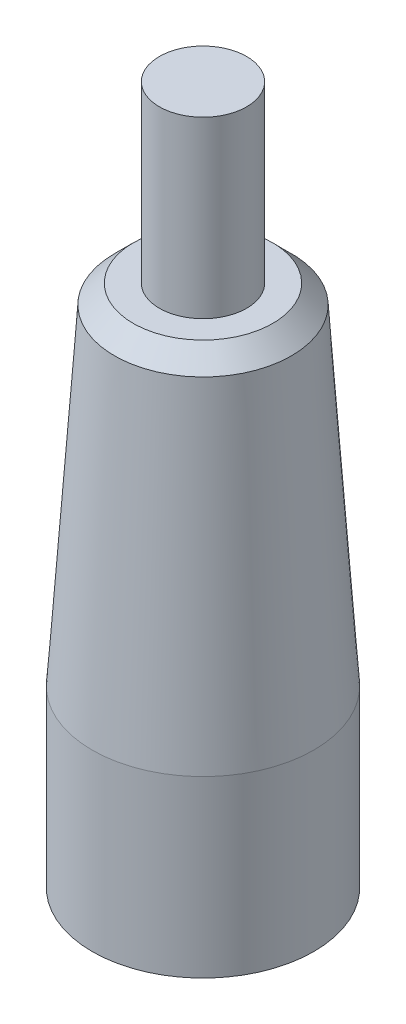
ISO-10303-21;
HEADER;
FILE_DESCRIPTION(('STEP AP214'),'2;1');
FILE_NAME('part.step','',(''),(''),'','','');
FILE_SCHEMA(('AUTOMOTIVE_DESIGN { 1 0 10303 214 1 1 1 1 }'));
ENDSEC;
DATA;
#1=APPLICATION_CONTEXT('core data for automotive mechanical design processes');
#2=APPLICATION_PROTOCOL_DEFINITION('international standard','automotive_design',2000,#1);
#3=PRODUCT_CONTEXT('',#1,'mechanical');
#4=PRODUCT('Part','Part','',(#3));
#5=PRODUCT_RELATED_PRODUCT_CATEGORY('part','',(#4));
#6=PRODUCT_DEFINITION_FORMATION('','',#4);
#7=PRODUCT_DEFINITION_CONTEXT('part definition',#1,'design');
#8=PRODUCT_DEFINITION('design','',#6,#7);
#9=PRODUCT_DEFINITION_SHAPE('','',#8);
#10=(LENGTH_UNIT() NAMED_UNIT(*) SI_UNIT(.MILLI.,.METRE.));
#11=(NAMED_UNIT(*) PLANE_ANGLE_UNIT() SI_UNIT($,.RADIAN.));
#12=(NAMED_UNIT(*) SI_UNIT($,.STERADIAN.) SOLID_ANGLE_UNIT());
#13=UNCERTAINTY_MEASURE_WITH_UNIT(LENGTH_MEASURE(1.E-05),#10,'distance_accuracy_value','');
#14=(GEOMETRIC_REPRESENTATION_CONTEXT(3) GLOBAL_UNCERTAINTY_ASSIGNED_CONTEXT((#13)) GLOBAL_UNIT_ASSIGNED_CONTEXT((#10,
#11,#12)) REPRESENTATION_CONTEXT('',''));
#15=CARTESIAN_POINT('',(0.,0.,0.));
#16=DIRECTION('',(0.,0.,1.));
#17=DIRECTION('',(1.,0.,0.));
#18=AXIS2_PLACEMENT_3D('',#15,#16,#17);
#19=CARTESIAN_POINT('',(3.175,0.,0.));
#20=DIRECTION('',(0.,-1.,0.));
#21=DIRECTION('',(1.,0.,0.));
#22=AXIS2_PLACEMENT_3D('',#19,#20,#21);
#23=PLANE('',#22);
#24=CARTESIAN_POINT('',(0.,0.,0.));
#25=DIRECTION('',(0.,-1.,0.));
#26=DIRECTION('',(1.,0.,0.));
#27=AXIS2_PLACEMENT_3D('',#24,#25,#26);
#28=CIRCLE('',#27,3.175);
#29=CARTESIAN_POINT('',(3.175,0.,0.));
#30=VERTEX_POINT('',#29);
#31=EDGE_CURVE('E59',#30,#30,#28,.T.);
#32=ORIENTED_EDGE('',*,*,#31,.T.);
#33=EDGE_LOOP('',(#32));
#34=FACE_BOUND('',#33,.T.);
#35=ADVANCED_FACE('F36',(#34),#23,.T.);
#36=CARTESIAN_POINT('',(0.,20.,0.));
#37=DIRECTION('',(0.,1.,0.));
#38=DIRECTION('',(-1.,0.,0.));
#39=AXIS2_PLACEMENT_3D('',#36,#37,#38);
#40=PLANE('',#39);
#41=CARTESIAN_POINT('',(0.,20.,0.));
#42=DIRECTION('',(0.,-1.,0.));
#43=DIRECTION('',(1.,0.,0.));
#44=AXIS2_PLACEMENT_3D('',#41,#42,#43);
#45=CIRCLE('',#44,1.25);
#46=CARTESIAN_POINT('',(1.25,20.,0.));
#47=VERTEX_POINT('',#46);
#48=EDGE_CURVE('E47',#47,#47,#45,.T.);
#49=ORIENTED_EDGE('',*,*,#48,.F.);
#50=EDGE_LOOP('',(#49));
#51=FACE_BOUND('',#50,.T.);
#52=ADVANCED_FACE('F77',(#51),#40,.T.);
#53=CARTESIAN_POINT('',(0.,0.,0.));
#54=DIRECTION('',(0.,-1.,0.));
#55=DIRECTION('',(1.,0.,0.));
#56=AXIS2_PLACEMENT_3D('',#53,#54,#55);
#57=CYLINDRICAL_SURFACE('',#56,1.25);
#58=ORIENTED_EDGE('',*,*,#48,.T.);
#59=EDGE_LOOP('',(#58));
#60=FACE_BOUND('',#59,.T.);
#61=CARTESIAN_POINT('',(0.,15.,0.));
#62=DIRECTION('',(0.,-1.,0.));
#63=DIRECTION('',(1.,0.,0.));
#64=AXIS2_PLACEMENT_3D('',#61,#62,#63);
#65=CIRCLE('',#64,1.25);
#66=CARTESIAN_POINT('',(1.25,15.,0.));
#67=VERTEX_POINT('',#66);
#68=EDGE_CURVE('E51',#67,#67,#65,.T.);
#69=ORIENTED_EDGE('',*,*,#68,.F.);
#70=EDGE_LOOP('',(#69));
#71=FACE_BOUND('',#70,.T.);
#72=ADVANCED_FACE('F81',(#60,#71),#57,.T.);
#73=CARTESIAN_POINT('',(1.25,15.,0.));
#74=DIRECTION('',(0.,1.,0.));
#75=DIRECTION('',(-1.,0.,0.));
#76=AXIS2_PLACEMENT_3D('',#73,#74,#75);
#77=PLANE('',#76);
#78=CARTESIAN_POINT('',(0.,15.,0.));
#79=DIRECTION('',(0.,1.,0.));
#80=DIRECTION('',(-1.,0.,0.));
#81=AXIS2_PLACEMENT_3D('',#78,#79,#80);
#82=CIRCLE('',#81,2.);
#83=CARTESIAN_POINT('',(-2.00000000000001,15.,0.));
#84=VERTEX_POINT('',#83);
#85=EDGE_CURVE('E10',#84,#84,#82,.T.);
#86=ORIENTED_EDGE('',*,*,#85,.T.);
#87=EDGE_LOOP('',(#86));
#88=FACE_BOUND('',#87,.T.);
#89=ORIENTED_EDGE('',*,*,#68,.T.);
#90=EDGE_LOOP('',(#89));
#91=FACE_BOUND('',#90,.T.);
#92=ADVANCED_FACE('F74',(#88,#91),#77,.T.);
#93=CARTESIAN_POINT('',(0.,5.,0.));
#94=DIRECTION('',(0.,-1.,0.));
#95=DIRECTION('',(1.,0.,0.));
#96=AXIS2_PLACEMENT_3D('',#93,#94,#95);
#97=CONICAL_SURFACE('',#96,3.175,0.0673977637182394);
#98=CARTESIAN_POINT('',(0.,14.4638069705094,0.));
#99=DIRECTION('',(0.,1.,0.));
#100=DIRECTION('',(-1.,0.,0.));
#101=AXIS2_PLACEMENT_3D('',#98,#99,#100);
#102=CIRCLE('',#101,2.53619302949062);
#103=CARTESIAN_POINT('',(-2.53619302949062,14.4638069705094,0.));
#104=VERTEX_POINT('',#103);
#105=EDGE_CURVE('E43',#104,#104,#102,.F.);
#106=ORIENTED_EDGE('',*,*,#105,.T.);
#107=EDGE_LOOP('',(#106));
#108=FACE_BOUND('',#107,.T.);
#109=CARTESIAN_POINT('',(0.,5.,0.));
#110=DIRECTION('',(0.,-1.,0.));
#111=DIRECTION('',(1.,0.,0.));
#112=AXIS2_PLACEMENT_3D('',#109,#110,#111);
#113=CIRCLE('',#112,3.175);
#114=CARTESIAN_POINT('',(3.175,5.,0.));
#115=VERTEX_POINT('',#114);
#116=EDGE_CURVE('E56',#115,#115,#113,.T.);
#117=ORIENTED_EDGE('',*,*,#116,.F.);
#118=EDGE_LOOP('',(#117));
#119=FACE_BOUND('',#118,.T.);
#120=ADVANCED_FACE('F66',(#108,#119),#97,.T.);
#121=CARTESIAN_POINT('',(0.,0.,0.));
#122=DIRECTION('',(0.,-1.,0.));
#123=DIRECTION('',(1.,0.,0.));
#124=AXIS2_PLACEMENT_3D('',#121,#122,#123);
#125=CYLINDRICAL_SURFACE('',#124,3.175);
#126=ORIENTED_EDGE('',*,*,#116,.T.);
#127=EDGE_LOOP('',(#126));
#128=FACE_BOUND('',#127,.T.);
#129=ORIENTED_EDGE('',*,*,#31,.F.);
#130=EDGE_LOOP('',(#129));
#131=FACE_BOUND('',#130,.T.);
#132=ADVANCED_FACE('F64',(#128,#131),#125,.T.);
#133=CARTESIAN_POINT('',(0.,14.4638069705094,0.));
#134=DIRECTION('',(0.,-1.,0.));
#135=DIRECTION('',(1.,0.,0.));
#136=AXIS2_PLACEMENT_3D('',#133,#134,#135);
#137=CONICAL_SURFACE('',#136,2.53619302949062,0.785398163397452);
#138=ORIENTED_EDGE('',*,*,#85,.F.);
#139=EDGE_LOOP('',(#138));
#140=FACE_BOUND('',#139,.T.);
#141=ORIENTED_EDGE('',*,*,#105,.F.);
#142=EDGE_LOOP('',(#141));
#143=FACE_BOUND('',#142,.T.);
#144=ADVANCED_FACE('F38',(#140,#143),#137,.T.);
#145=CLOSED_SHELL('',(#35,#52,#72,#92,#120,#132,#144));
#146=MANIFOLD_SOLID_BREP('B2',#145);
#147=ADVANCED_BREP_SHAPE_REPRESENTATION('',(#18,#146),#14);
#148=SHAPE_DEFINITION_REPRESENTATION(#9,#147);
ENDSEC;
END-ISO-10303-21;
